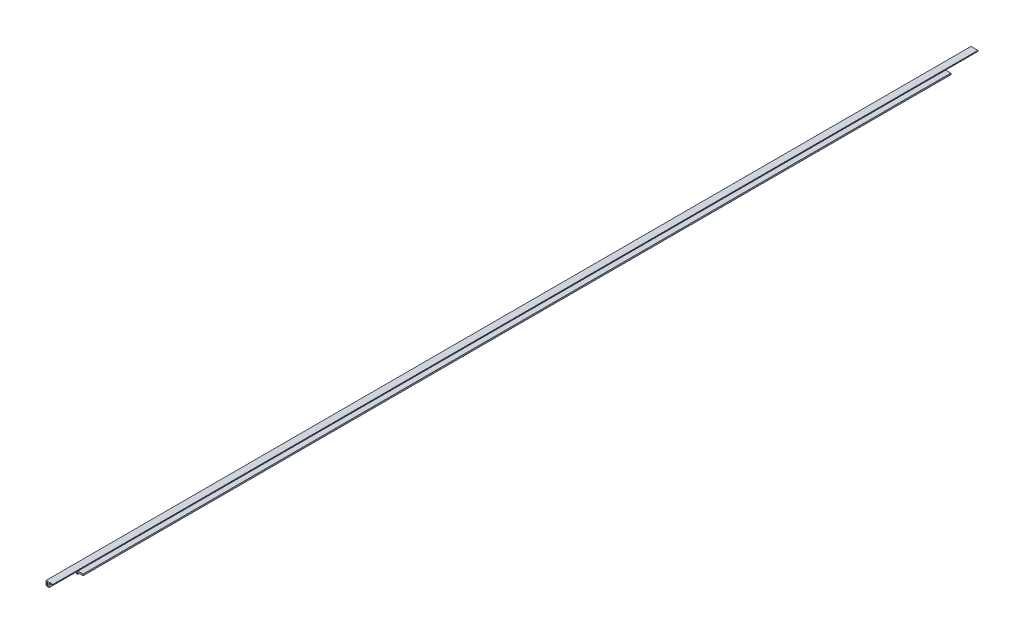
ISO-10303-21;
HEADER;
FILE_DESCRIPTION(('STEP AP214'),'2;1');
FILE_NAME('part.step','',(''),(''),'','','');
FILE_SCHEMA(('AUTOMOTIVE_DESIGN { 1 0 10303 214 1 1 1 1 }'));
ENDSEC;
DATA;
#1=APPLICATION_CONTEXT('core data for automotive mechanical design processes');
#2=APPLICATION_PROTOCOL_DEFINITION('international standard','automotive_design',2000,#1);
#3=PRODUCT_CONTEXT('',#1,'mechanical');
#4=PRODUCT('Part','Part','',(#3));
#5=PRODUCT_RELATED_PRODUCT_CATEGORY('part','',(#4));
#6=PRODUCT_DEFINITION_FORMATION('','',#4);
#7=PRODUCT_DEFINITION_CONTEXT('part definition',#1,'design');
#8=PRODUCT_DEFINITION('design','',#6,#7);
#9=PRODUCT_DEFINITION_SHAPE('','',#8);
#10=(LENGTH_UNIT() NAMED_UNIT(*) SI_UNIT(.MILLI.,.METRE.));
#11=(NAMED_UNIT(*) PLANE_ANGLE_UNIT() SI_UNIT($,.RADIAN.));
#12=(NAMED_UNIT(*) SI_UNIT($,.STERADIAN.) SOLID_ANGLE_UNIT());
#13=UNCERTAINTY_MEASURE_WITH_UNIT(LENGTH_MEASURE(1.E-05),#10,'distance_accuracy_value','');
#14=(GEOMETRIC_REPRESENTATION_CONTEXT(3) GLOBAL_UNCERTAINTY_ASSIGNED_CONTEXT((#13)) GLOBAL_UNIT_ASSIGNED_CONTEXT((#10,
#11,#12)) REPRESENTATION_CONTEXT('',''));
#15=CARTESIAN_POINT('',(0.,0.,0.));
#16=DIRECTION('',(0.,0.,1.));
#17=DIRECTION('',(1.,0.,0.));
#18=AXIS2_PLACEMENT_3D('',#15,#16,#17);
#19=CARTESIAN_POINT('',(-2.5,27.5,1403.5));
#20=DIRECTION('',(-1.,0.,0.));
#21=DIRECTION('',(0.,-1.,0.));
#22=AXIS2_PLACEMENT_3D('',#19,#20,#21);
#23=PLANE('',#22);
#24=DIRECTION('',(0.,0.,1.));
#25=VECTOR('',#24,1.);
#26=CARTESIAN_POINT('',(-2.5,27.5,1403.5));
#27=LINE('',#26,#25);
#28=CARTESIAN_POINT('',(-2.5,27.5,-1403.5));
#29=VERTEX_POINT('',#28);
#30=CARTESIAN_POINT('',(-2.5,27.5,1403.5));
#31=VERTEX_POINT('',#30);
#32=EDGE_CURVE('E506',#29,#31,#27,.T.);
#33=ORIENTED_EDGE('',*,*,#32,.T.);
#34=DIRECTION('',(0.,1.,0.));
#35=VECTOR('',#34,1.);
#36=CARTESIAN_POINT('',(-2.5,0.,1403.5));
#37=LINE('',#36,#35);
#38=CARTESIAN_POINT('',(-2.49999999999999,16.5,1403.5));
#39=VERTEX_POINT('',#38);
#40=EDGE_CURVE('E220',#31,#39,#37,.F.);
#41=ORIENTED_EDGE('',*,*,#40,.T.);
#42=DIRECTION('',(0.,0.,1.));
#43=VECTOR('',#42,1.);
#44=CARTESIAN_POINT('',(-2.49999999999999,16.5,1403.5));
#45=LINE('',#44,#43);
#46=CARTESIAN_POINT('',(-2.49999999999999,16.5,-1403.5));
#47=VERTEX_POINT('',#46);
#48=EDGE_CURVE('E19',#39,#47,#45,.F.);
#49=ORIENTED_EDGE('',*,*,#48,.T.);
#50=DIRECTION('',(0.,1.,0.));
#51=VECTOR('',#50,1.);
#52=CARTESIAN_POINT('',(-2.5,0.,-1403.5));
#53=LINE('',#52,#51);
#54=EDGE_CURVE('E217',#29,#47,#53,.F.);
#55=ORIENTED_EDGE('',*,*,#54,.F.);
#56=EDGE_LOOP('',(#33,#41,#49,#55));
#57=FACE_BOUND('',#56,.T.);
#58=ADVANCED_FACE('F16',(#57),#23,.F.);
#59=CARTESIAN_POINT('',(-2.49999999999999,16.5,1403.5));
#60=DIRECTION('',(0.,1.,0.));
#61=DIRECTION('',(0.,0.,1.));
#62=AXIS2_PLACEMENT_3D('',#59,#60,#61);
#63=PLANE('',#62);
#64=ORIENTED_EDGE('',*,*,#48,.F.);
#65=DIRECTION('',(-1.,0.,0.));
#66=VECTOR('',#65,1.);
#67=CARTESIAN_POINT('',(0.,16.5,1403.5));
#68=LINE('',#67,#66);
#69=CARTESIAN_POINT('',(-5.29999999999999,16.5,1403.5));
#70=VERTEX_POINT('',#69);
#71=EDGE_CURVE('E492',#39,#70,#68,.T.);
#72=ORIENTED_EDGE('',*,*,#71,.T.);
#73=DIRECTION('',(0.,0.,1.));
#74=VECTOR('',#73,1.);
#75=CARTESIAN_POINT('',(-5.29999999999999,16.5,1403.5));
#76=LINE('',#75,#74);
#77=CARTESIAN_POINT('',(-5.29999999999999,16.5,-1403.5));
#78=VERTEX_POINT('',#77);
#79=EDGE_CURVE('E207',#70,#78,#76,.F.);
#80=ORIENTED_EDGE('',*,*,#79,.T.);
#81=DIRECTION('',(-1.,0.,0.));
#82=VECTOR('',#81,1.);
#83=CARTESIAN_POINT('',(0.,16.5,-1403.5));
#84=LINE('',#83,#82);
#85=EDGE_CURVE('E222',#47,#78,#84,.T.);
#86=ORIENTED_EDGE('',*,*,#85,.F.);
#87=EDGE_LOOP('',(#64,#72,#80,#86));
#88=FACE_BOUND('',#87,.T.);
#89=ADVANCED_FACE('F223',(#88),#63,.F.);
#90=CARTESIAN_POINT('',(-5.29999999999999,16.5,1403.5));
#91=DIRECTION('',(1.,0.,0.));
#92=DIRECTION('',(0.,1.,0.));
#93=AXIS2_PLACEMENT_3D('',#90,#91,#92);
#94=PLANE('',#93);
#95=ORIENTED_EDGE('',*,*,#79,.F.);
#96=DIRECTION('',(0.,1.,0.));
#97=VECTOR('',#96,1.);
#98=CARTESIAN_POINT('',(-5.29999999999999,0.,1403.5));
#99=LINE('',#98,#97);
#100=CARTESIAN_POINT('',(-5.29999999999999,30.,1403.5));
#101=VERTEX_POINT('',#100);
#102=EDGE_CURVE('E489',#70,#101,#99,.T.);
#103=ORIENTED_EDGE('',*,*,#102,.T.);
#104=DIRECTION('',(0.,0.,-1.));
#105=VECTOR('',#104,1.);
#106=CARTESIAN_POINT('',(-5.3,30.,1403.5));
#107=LINE('',#106,#105);
#108=CARTESIAN_POINT('',(-5.29999999999999,30.,-1403.5));
#109=VERTEX_POINT('',#108);
#110=EDGE_CURVE('E205',#101,#109,#107,.T.);
#111=ORIENTED_EDGE('',*,*,#110,.T.);
#112=DIRECTION('',(0.,1.,0.));
#113=VECTOR('',#112,1.);
#114=CARTESIAN_POINT('',(-5.29999999999999,0.,-1403.5));
#115=LINE('',#114,#113);
#116=EDGE_CURVE('E225',#78,#109,#115,.T.);
#117=ORIENTED_EDGE('',*,*,#116,.F.);
#118=EDGE_LOOP('',(#95,#103,#111,#117));
#119=FACE_BOUND('',#118,.T.);
#120=ADVANCED_FACE('F450',(#119),#94,.F.);
#121=CARTESIAN_POINT('',(-5.3,30.,1403.5));
#122=DIRECTION('',(0.,-1.,0.));
#123=DIRECTION('',(0.,0.,-1.));
#124=AXIS2_PLACEMENT_3D('',#121,#122,#123);
#125=PLANE('',#124);
#126=ORIENTED_EDGE('',*,*,#110,.F.);
#127=DIRECTION('',(-1.,0.,0.));
#128=VECTOR('',#127,1.);
#129=CARTESIAN_POINT('',(0.,30.,1403.5));
#130=LINE('',#129,#128);
#131=CARTESIAN_POINT('',(15.7,30.,1403.5));
#132=VERTEX_POINT('',#131);
#133=EDGE_CURVE('E495',#101,#132,#130,.F.);
#134=ORIENTED_EDGE('',*,*,#133,.T.);
#135=DIRECTION('',(0.,0.,1.));
#136=VECTOR('',#135,1.);
#137=CARTESIAN_POINT('',(15.7,30.,1403.5));
#138=LINE('',#137,#136);
#139=CARTESIAN_POINT('',(15.7,30.,-1403.5));
#140=VERTEX_POINT('',#139);
#141=EDGE_CURVE('E202',#132,#140,#138,.F.);
#142=ORIENTED_EDGE('',*,*,#141,.T.);
#143=DIRECTION('',(-1.,0.,0.));
#144=VECTOR('',#143,1.);
#145=CARTESIAN_POINT('',(0.,30.,-1403.5));
#146=LINE('',#145,#144);
#147=EDGE_CURVE('E227',#109,#140,#146,.F.);
#148=ORIENTED_EDGE('',*,*,#147,.F.);
#149=EDGE_LOOP('',(#126,#134,#142,#148));
#150=FACE_BOUND('',#149,.T.);
#151=ADVANCED_FACE('F441',(#150),#125,.F.);
#152=CARTESIAN_POINT('',(15.7,30.,1403.5));
#153=DIRECTION('',(-1.,0.,0.));
#154=DIRECTION('',(0.,-1.,0.));
#155=AXIS2_PLACEMENT_3D('',#152,#153,#154);
#156=PLANE('',#155);
#157=ORIENTED_EDGE('',*,*,#141,.F.);
#158=DIRECTION('',(0.,1.,0.));
#159=VECTOR('',#158,1.);
#160=CARTESIAN_POINT('',(15.7,0.,1403.5));
#161=LINE('',#160,#159);
#162=CARTESIAN_POINT('',(15.7,27.5,1403.5));
#163=VERTEX_POINT('',#162);
#164=EDGE_CURVE('E516',#132,#163,#161,.F.);
#165=ORIENTED_EDGE('',*,*,#164,.T.);
#166=DIRECTION('',(0.,0.,1.));
#167=VECTOR('',#166,1.);
#168=CARTESIAN_POINT('',(15.7,27.5,1403.5));
#169=LINE('',#168,#167);
#170=CARTESIAN_POINT('',(15.7,27.5,-1403.5));
#171=VERTEX_POINT('',#170);
#172=EDGE_CURVE('E199',#163,#171,#169,.F.);
#173=ORIENTED_EDGE('',*,*,#172,.T.);
#174=DIRECTION('',(0.,1.,0.));
#175=VECTOR('',#174,1.);
#176=CARTESIAN_POINT('',(15.7,0.,-1403.5));
#177=LINE('',#176,#175);
#178=EDGE_CURVE('E511',#140,#171,#177,.F.);
#179=ORIENTED_EDGE('',*,*,#178,.F.);
#180=EDGE_LOOP('',(#157,#165,#173,#179));
#181=FACE_BOUND('',#180,.T.);
#182=ADVANCED_FACE('F432',(#181),#156,.F.);
#183=CARTESIAN_POINT('',(15.7,27.5,1403.5));
#184=DIRECTION('',(0.,1.,0.));
#185=DIRECTION('',(-1.,0.,0.));
#186=AXIS2_PLACEMENT_3D('',#183,#184,#185);
#187=PLANE('',#186);
#188=ORIENTED_EDGE('',*,*,#172,.F.);
#189=DIRECTION('',(-1.,0.,0.));
#190=VECTOR('',#189,1.);
#191=CARTESIAN_POINT('',(0.,27.5,1403.5));
#192=LINE('',#191,#190);
#193=CARTESIAN_POINT('',(4.5,27.5,1403.5));
#194=VERTEX_POINT('',#193);
#195=EDGE_CURVE('E582',#163,#194,#192,.T.);
#196=ORIENTED_EDGE('',*,*,#195,.T.);
#197=DIRECTION('',(0.,0.,1.));
#198=VECTOR('',#197,1.);
#199=CARTESIAN_POINT('',(4.5,27.5,1403.5));
#200=LINE('',#199,#198);
#201=CARTESIAN_POINT('',(4.5,27.5,-1403.5));
#202=VERTEX_POINT('',#201);
#203=EDGE_CURVE('E197',#194,#202,#200,.F.);
#204=ORIENTED_EDGE('',*,*,#203,.T.);
#205=DIRECTION('',(-1.,0.,0.));
#206=VECTOR('',#205,1.);
#207=CARTESIAN_POINT('',(0.,27.5,-1403.5));
#208=LINE('',#207,#206);
#209=EDGE_CURVE('E508',#171,#202,#208,.T.);
#210=ORIENTED_EDGE('',*,*,#209,.F.);
#211=EDGE_LOOP('',(#188,#196,#204,#210));
#212=FACE_BOUND('',#211,.T.);
#213=ADVANCED_FACE('F423',(#212),#187,.F.);
#214=CARTESIAN_POINT('',(4.5,27.5,1403.5));
#215=DIRECTION('',(-1.,0.,0.));
#216=DIRECTION('',(0.,-1.,0.));
#217=AXIS2_PLACEMENT_3D('',#214,#215,#216);
#218=PLANE('',#217);
#219=ORIENTED_EDGE('',*,*,#203,.F.);
#220=DIRECTION('',(0.,1.,0.));
#221=VECTOR('',#220,1.);
#222=CARTESIAN_POINT('',(4.5,0.,1403.5));
#223=LINE('',#222,#221);
#224=CARTESIAN_POINT('',(4.5,16.,1403.5));
#225=VERTEX_POINT('',#224);
#226=EDGE_CURVE('E580',#194,#225,#223,.F.);
#227=ORIENTED_EDGE('',*,*,#226,.T.);
#228=DIRECTION('',(0.,0.,1.));
#229=VECTOR('',#228,1.);
#230=CARTESIAN_POINT('',(4.5,16.,1403.5));
#231=LINE('',#230,#229);
#232=CARTESIAN_POINT('',(4.5,16.,1316.5));
#233=VERTEX_POINT('',#232);
#234=EDGE_CURVE('E578',#225,#233,#231,.F.);
#235=ORIENTED_EDGE('',*,*,#234,.T.);
#236=DIRECTION('',(0.,0.,-1.));
#237=VECTOR('',#236,1.);
#238=CARTESIAN_POINT('',(4.5,16.,1403.5));
#239=LINE('',#238,#237);
#240=CARTESIAN_POINT('',(4.5,16.,-1316.5));
#241=VERTEX_POINT('',#240);
#242=EDGE_CURVE('E195',#233,#241,#239,.T.);
#243=ORIENTED_EDGE('',*,*,#242,.T.);
#244=DIRECTION('',(0.,0.,-1.));
#245=VECTOR('',#244,1.);
#246=CARTESIAN_POINT('',(4.5,16.,-1403.5));
#247=LINE('',#246,#245);
#248=CARTESIAN_POINT('',(4.5,16.,-1403.5));
#249=VERTEX_POINT('',#248);
#250=EDGE_CURVE('E238',#249,#241,#247,.F.);
#251=ORIENTED_EDGE('',*,*,#250,.F.);
#252=DIRECTION('',(0.,1.,0.));
#253=VECTOR('',#252,1.);
#254=CARTESIAN_POINT('',(4.5,0.,-1403.5));
#255=LINE('',#254,#253);
#256=EDGE_CURVE('E234',#202,#249,#255,.F.);
#257=ORIENTED_EDGE('',*,*,#256,.F.);
#258=EDGE_LOOP('',(#219,#227,#235,#243,#251,#257));
#259=FACE_BOUND('',#258,.T.);
#260=ADVANCED_FACE('F414',(#259),#218,.F.);
#261=CARTESIAN_POINT('',(4.5,16.,1403.5));
#262=DIRECTION('',(0.,-1.,0.));
#263=DIRECTION('',(0.,0.,-1.));
#264=AXIS2_PLACEMENT_3D('',#261,#262,#263);
#265=PLANE('',#264);
#266=ORIENTED_EDGE('',*,*,#242,.F.);
#267=DIRECTION('',(-1.,0.,0.));
#268=VECTOR('',#267,1.);
#269=CARTESIAN_POINT('',(-5.3,16.,1316.5));
#270=LINE('',#269,#268);
#271=CARTESIAN_POINT('',(20.2,16.,1316.5));
#272=VERTEX_POINT('',#271);
#273=EDGE_CURVE('E567',#233,#272,#270,.F.);
#274=ORIENTED_EDGE('',*,*,#273,.T.);
#275=DIRECTION('',(0.,0.,1.));
#276=VECTOR('',#275,1.);
#277=CARTESIAN_POINT('',(20.2,16.,1403.5));
#278=LINE('',#277,#276);
#279=CARTESIAN_POINT('',(20.2,16.,-1316.5));
#280=VERTEX_POINT('',#279);
#281=EDGE_CURVE('E192',#272,#280,#278,.F.);
#282=ORIENTED_EDGE('',*,*,#281,.T.);
#283=DIRECTION('',(-1.,0.,0.));
#284=VECTOR('',#283,1.);
#285=CARTESIAN_POINT('',(-5.3,16.,-1316.5));
#286=LINE('',#285,#284);
#287=EDGE_CURVE('E182',#241,#280,#286,.F.);
#288=ORIENTED_EDGE('',*,*,#287,.F.);
#289=EDGE_LOOP('',(#266,#274,#282,#288));
#290=FACE_BOUND('',#289,.T.);
#291=ADVANCED_FACE('F259',(#290),#265,.F.);
#292=CARTESIAN_POINT('',(20.2,16.,1403.5));
#293=DIRECTION('',(-1.,0.,0.));
#294=DIRECTION('',(0.,0.,1.));
#295=AXIS2_PLACEMENT_3D('',#292,#293,#294);
#296=PLANE('',#295);
#297=ORIENTED_EDGE('',*,*,#281,.F.);
#298=DIRECTION('',(0.,1.,0.));
#299=VECTOR('',#298,1.);
#300=CARTESIAN_POINT('',(20.2,16.,1316.5));
#301=LINE('',#300,#299);
#302=CARTESIAN_POINT('',(20.2,11.5,1316.5));
#303=VERTEX_POINT('',#302);
#304=EDGE_CURVE('E248',#272,#303,#301,.F.);
#305=ORIENTED_EDGE('',*,*,#304,.T.);
#306=DIRECTION('',(0.,0.,1.));
#307=VECTOR('',#306,1.);
#308=CARTESIAN_POINT('',(20.2,11.5,1403.5));
#309=LINE('',#308,#307);
#310=CARTESIAN_POINT('',(20.2,11.5,-1316.5));
#311=VERTEX_POINT('',#310);
#312=EDGE_CURVE('E189',#303,#311,#309,.F.);
#313=ORIENTED_EDGE('',*,*,#312,.T.);
#314=DIRECTION('',(0.,1.,0.));
#315=VECTOR('',#314,1.);
#316=CARTESIAN_POINT('',(20.2,16.,-1316.5));
#317=LINE('',#316,#315);
#318=EDGE_CURVE('E184',#280,#311,#317,.F.);
#319=ORIENTED_EDGE('',*,*,#318,.F.);
#320=EDGE_LOOP('',(#297,#305,#313,#319));
#321=FACE_BOUND('',#320,.T.);
#322=ADVANCED_FACE('F246',(#321),#296,.F.);
#323=CARTESIAN_POINT('',(20.2,11.5,1403.5));
#324=DIRECTION('',(0.,1.,0.));
#325=DIRECTION('',(-1.,0.,0.));
#326=AXIS2_PLACEMENT_3D('',#323,#324,#325);
#327=PLANE('',#326);
#328=ORIENTED_EDGE('',*,*,#312,.F.);
#329=DIRECTION('',(-1.,0.,0.));
#330=VECTOR('',#329,1.);
#331=CARTESIAN_POINT('',(-5.3,11.5,1316.5));
#332=LINE('',#331,#330);
#333=CARTESIAN_POINT('',(4.,11.5,1316.5));
#334=VERTEX_POINT('',#333);
#335=EDGE_CURVE('E564',#303,#334,#332,.T.);
#336=ORIENTED_EDGE('',*,*,#335,.T.);
#337=DIRECTION('',(0.,0.,1.));
#338=VECTOR('',#337,1.);
#339=CARTESIAN_POINT('',(4.,11.5,1403.5));
#340=LINE('',#339,#338);
#341=CARTESIAN_POINT('',(4.,11.5,-1316.5));
#342=VERTEX_POINT('',#341);
#343=EDGE_CURVE('E155',#334,#342,#340,.F.);
#344=ORIENTED_EDGE('',*,*,#343,.T.);
#345=DIRECTION('',(-1.,0.,0.));
#346=VECTOR('',#345,1.);
#347=CARTESIAN_POINT('',(-5.3,11.5,-1316.5));
#348=LINE('',#347,#346);
#349=EDGE_CURVE('E167',#311,#342,#348,.T.);
#350=ORIENTED_EDGE('',*,*,#349,.F.);
#351=EDGE_LOOP('',(#328,#336,#344,#350));
#352=FACE_BOUND('',#351,.T.);
#353=ADVANCED_FACE('F250',(#352),#327,.F.);
#354=CARTESIAN_POINT('',(4.,11.5,1403.5));
#355=DIRECTION('',(-1.,0.,0.));
#356=DIRECTION('',(0.,0.,1.));
#357=AXIS2_PLACEMENT_3D('',#354,#355,#356);
#358=PLANE('',#357);
#359=DIRECTION('',(0.,0.,-1.));
#360=VECTOR('',#359,1.);
#361=CARTESIAN_POINT('',(4.,7.,-1316.5));
#362=LINE('',#361,#360);
#363=CARTESIAN_POINT('',(4.,7.,-1316.5));
#364=VERTEX_POINT('',#363);
#365=CARTESIAN_POINT('',(4.,7.,-1286.5));
#366=VERTEX_POINT('',#365);
#367=EDGE_CURVE('E169',#364,#366,#362,.F.);
#368=ORIENTED_EDGE('',*,*,#367,.F.);
#369=DIRECTION('',(0.,1.,0.));
#370=VECTOR('',#369,1.);
#371=CARTESIAN_POINT('',(4.,16.,-1316.5));
#372=LINE('',#371,#370);
#373=EDGE_CURVE('E160',#342,#364,#372,.F.);
#374=ORIENTED_EDGE('',*,*,#373,.F.);
#375=ORIENTED_EDGE('',*,*,#343,.F.);
#376=DIRECTION('',(0.,1.,0.));
#377=VECTOR('',#376,1.);
#378=CARTESIAN_POINT('',(4.,16.,1316.5));
#379=LINE('',#378,#377);
#380=CARTESIAN_POINT('',(4.,7.,1316.5));
#381=VERTEX_POINT('',#380);
#382=EDGE_CURVE('E573',#334,#381,#379,.F.);
#383=ORIENTED_EDGE('',*,*,#382,.T.);
#384=DIRECTION('',(0.,0.,1.));
#385=VECTOR('',#384,1.);
#386=CARTESIAN_POINT('',(4.,7.,1316.5));
#387=LINE('',#386,#385);
#388=CARTESIAN_POINT('',(4.,7.,1286.5));
#389=VERTEX_POINT('',#388);
#390=EDGE_CURVE('E561',#381,#389,#387,.F.);
#391=ORIENTED_EDGE('',*,*,#390,.T.);
#392=DIRECTION('',(0.,1.,0.));
#393=VECTOR('',#392,1.);
#394=CARTESIAN_POINT('',(4.,0.,1286.5));
#395=LINE('',#394,#393);
#396=CARTESIAN_POINT('',(4.,0.,1286.5));
#397=VERTEX_POINT('',#396);
#398=EDGE_CURVE('E556',#389,#397,#395,.F.);
#399=ORIENTED_EDGE('',*,*,#398,.T.);
#400=DIRECTION('',(0.,0.,1.));
#401=VECTOR('',#400,1.);
#402=CARTESIAN_POINT('',(4.,0.,1403.5));
#403=LINE('',#402,#401);
#404=CARTESIAN_POINT('',(4.,0.,-1286.5));
#405=VERTEX_POINT('',#404);
#406=EDGE_CURVE('E548',#397,#405,#403,.F.);
#407=ORIENTED_EDGE('',*,*,#406,.T.);
#408=DIRECTION('',(0.,1.,0.));
#409=VECTOR('',#408,1.);
#410=CARTESIAN_POINT('',(4.,0.,-1286.5));
#411=LINE('',#410,#409);
#412=EDGE_CURVE('E174',#366,#405,#411,.F.);
#413=ORIENTED_EDGE('',*,*,#412,.F.);
#414=EDGE_LOOP('',(#368,#374,#375,#383,#391,#399,#407,#413));
#415=FACE_BOUND('',#414,.T.);
#416=ADVANCED_FACE('F172',(#415),#358,.F.);
#417=CARTESIAN_POINT('',(-5.3,7.,-1316.5));
#418=DIRECTION('',(0.,-1.,0.));
#419=DIRECTION('',(0.,0.,-1.));
#420=AXIS2_PLACEMENT_3D('',#417,#418,#419);
#421=PLANE('',#420);
#422=DIRECTION('',(0.,0.,1.));
#423=VECTOR('',#422,1.);
#424=CARTESIAN_POINT('',(0.,7.,1403.5));
#425=LINE('',#424,#423);
#426=CARTESIAN_POINT('',(0.,7.,-1286.5));
#427=VERTEX_POINT('',#426);
#428=CARTESIAN_POINT('',(0.,7.,-1316.5));
#429=VERTEX_POINT('',#428);
#430=EDGE_CURVE('E181',#427,#429,#425,.F.);
#431=ORIENTED_EDGE('',*,*,#430,.T.);
#432=DIRECTION('',(-1.,0.,0.));
#433=VECTOR('',#432,1.);
#434=CARTESIAN_POINT('',(-5.3,7.,-1316.5));
#435=LINE('',#434,#433);
#436=EDGE_CURVE('E165',#364,#429,#435,.T.);
#437=ORIENTED_EDGE('',*,*,#436,.F.);
#438=ORIENTED_EDGE('',*,*,#367,.T.);
#439=DIRECTION('',(-1.,0.,0.));
#440=VECTOR('',#439,1.);
#441=CARTESIAN_POINT('',(-5.3,7.,-1286.5));
#442=LINE('',#441,#440);
#443=EDGE_CURVE('E544',#427,#366,#442,.F.);
#444=ORIENTED_EDGE('',*,*,#443,.F.);
#445=EDGE_LOOP('',(#431,#437,#438,#444));
#446=FACE_BOUND('',#445,.T.);
#447=ADVANCED_FACE('F180',(#446),#421,.T.);
#448=CARTESIAN_POINT('',(-5.3,16.,-1316.5));
#449=DIRECTION('',(0.,0.,-1.));
#450=DIRECTION('',(-1.,0.,0.));
#451=AXIS2_PLACEMENT_3D('',#448,#449,#450);
#452=PLANE('',#451);
#453=ORIENTED_EDGE('',*,*,#318,.T.);
#454=ORIENTED_EDGE('',*,*,#349,.T.);
#455=ORIENTED_EDGE('',*,*,#373,.T.);
#456=ORIENTED_EDGE('',*,*,#436,.T.);
#457=DIRECTION('',(0.,1.,0.));
#458=VECTOR('',#457,1.);
#459=CARTESIAN_POINT('',(0.,0.,-1316.5));
#460=LINE('',#459,#458);
#461=CARTESIAN_POINT('',(0.,16.,-1316.5));
#462=VERTEX_POINT('',#461);
#463=EDGE_CURVE('E538',#429,#462,#460,.T.);
#464=ORIENTED_EDGE('',*,*,#463,.T.);
#465=DIRECTION('',(1.,0.,0.));
#466=VECTOR('',#465,1.);
#467=CARTESIAN_POINT('',(-5.3,16.,-1316.5));
#468=LINE('',#467,#466);
#469=EDGE_CURVE('E236',#241,#462,#468,.F.);
#470=ORIENTED_EDGE('',*,*,#469,.F.);
#471=ORIENTED_EDGE('',*,*,#287,.T.);
#472=EDGE_LOOP('',(#453,#454,#455,#456,#464,#470,#471));
#473=FACE_BOUND('',#472,.T.);
#474=ADVANCED_FACE('F162',(#473),#452,.T.);
#475=CARTESIAN_POINT('',(-5.3,16.,-1403.5));
#476=DIRECTION('',(0.,-1.,0.));
#477=DIRECTION('',(0.,0.,-1.));
#478=AXIS2_PLACEMENT_3D('',#475,#476,#477);
#479=PLANE('',#478);
#480=DIRECTION('',(0.,0.,1.));
#481=VECTOR('',#480,1.);
#482=CARTESIAN_POINT('',(0.,16.,1403.5));
#483=LINE('',#482,#481);
#484=CARTESIAN_POINT('',(0.,16.,-1403.5));
#485=VERTEX_POINT('',#484);
#486=EDGE_CURVE('E527',#462,#485,#483,.F.);
#487=ORIENTED_EDGE('',*,*,#486,.T.);
#488=DIRECTION('',(-1.,0.,0.));
#489=VECTOR('',#488,1.);
#490=CARTESIAN_POINT('',(0.,16.,-1403.5));
#491=LINE('',#490,#489);
#492=EDGE_CURVE('E229',#249,#485,#491,.T.);
#493=ORIENTED_EDGE('',*,*,#492,.F.);
#494=ORIENTED_EDGE('',*,*,#250,.T.);
#495=ORIENTED_EDGE('',*,*,#469,.T.);
#496=EDGE_LOOP('',(#487,#493,#494,#495));
#497=FACE_BOUND('',#496,.T.);
#498=ADVANCED_FACE('F303',(#497),#479,.T.);
#499=CARTESIAN_POINT('',(0.,0.,-1403.5));
#500=DIRECTION('',(0.,0.,-1.));
#501=DIRECTION('',(-1.,0.,0.));
#502=AXIS2_PLACEMENT_3D('',#499,#500,#501);
#503=PLANE('',#502);
#504=ORIENTED_EDGE('',*,*,#178,.T.);
#505=ORIENTED_EDGE('',*,*,#209,.T.);
#506=ORIENTED_EDGE('',*,*,#256,.T.);
#507=ORIENTED_EDGE('',*,*,#492,.T.);
#508=DIRECTION('',(0.,1.,0.));
#509=VECTOR('',#508,1.);
#510=CARTESIAN_POINT('',(0.,0.,-1403.5));
#511=LINE('',#510,#509);
#512=CARTESIAN_POINT('',(0.,27.5,-1403.5));
#513=VERTEX_POINT('',#512);
#514=EDGE_CURVE('E530',#485,#513,#511,.T.);
#515=ORIENTED_EDGE('',*,*,#514,.T.);
#516=DIRECTION('',(1.,0.,0.));
#517=VECTOR('',#516,1.);
#518=CARTESIAN_POINT('',(0.,27.5,-1403.5));
#519=LINE('',#518,#517);
#520=EDGE_CURVE('E504',#513,#29,#519,.F.);
#521=ORIENTED_EDGE('',*,*,#520,.T.);
#522=ORIENTED_EDGE('',*,*,#54,.T.);
#523=ORIENTED_EDGE('',*,*,#85,.T.);
#524=ORIENTED_EDGE('',*,*,#116,.T.);
#525=ORIENTED_EDGE('',*,*,#147,.T.);
#526=EDGE_LOOP('',(#504,#505,#506,#507,#515,#521,#522,#523,#524,#525));
#527=FACE_BOUND('',#526,.T.);
#528=ADVANCED_FACE('F299',(#527),#503,.T.);
#529=CARTESIAN_POINT('',(0.,27.5,1403.5));
#530=DIRECTION('',(0.,1.,0.));
#531=DIRECTION('',(0.,0.,1.));
#532=AXIS2_PLACEMENT_3D('',#529,#530,#531);
#533=PLANE('',#532);
#534=DIRECTION('',(0.,0.,1.));
#535=VECTOR('',#534,1.);
#536=CARTESIAN_POINT('',(0.,27.5,1403.5));
#537=LINE('',#536,#535);
#538=CARTESIAN_POINT('',(0.,27.5,1403.5));
#539=VERTEX_POINT('',#538);
#540=EDGE_CURVE('E534',#513,#539,#537,.T.);
#541=ORIENTED_EDGE('',*,*,#540,.T.);
#542=DIRECTION('',(-1.,0.,0.));
#543=VECTOR('',#542,1.);
#544=CARTESIAN_POINT('',(0.,27.5,1403.5));
#545=LINE('',#544,#543);
#546=EDGE_CURVE('E498',#539,#31,#545,.T.);
#547=ORIENTED_EDGE('',*,*,#546,.T.);
#548=ORIENTED_EDGE('',*,*,#32,.F.);
#549=ORIENTED_EDGE('',*,*,#520,.F.);
#550=EDGE_LOOP('',(#541,#547,#548,#549));
#551=FACE_BOUND('',#550,.T.);
#552=ADVANCED_FACE('F295',(#551),#533,.F.);
#553=CARTESIAN_POINT('',(0.,0.,1403.5));
#554=DIRECTION('',(0.,0.,-1.));
#555=DIRECTION('',(-1.,0.,0.));
#556=AXIS2_PLACEMENT_3D('',#553,#554,#555);
#557=PLANE('',#556);
#558=DIRECTION('',(1.,0.,0.));
#559=VECTOR('',#558,1.);
#560=CARTESIAN_POINT('',(-5.3,16.,1403.5));
#561=LINE('',#560,#559);
#562=CARTESIAN_POINT('',(0.,16.,1403.5));
#563=VERTEX_POINT('',#562);
#564=EDGE_CURVE('E576',#563,#225,#561,.T.);
#565=ORIENTED_EDGE('',*,*,#564,.T.);
#566=ORIENTED_EDGE('',*,*,#226,.F.);
#567=ORIENTED_EDGE('',*,*,#195,.F.);
#568=ORIENTED_EDGE('',*,*,#164,.F.);
#569=ORIENTED_EDGE('',*,*,#133,.F.);
#570=ORIENTED_EDGE('',*,*,#102,.F.);
#571=ORIENTED_EDGE('',*,*,#71,.F.);
#572=ORIENTED_EDGE('',*,*,#40,.F.);
#573=ORIENTED_EDGE('',*,*,#546,.F.);
#574=DIRECTION('',(0.,1.,0.));
#575=VECTOR('',#574,1.);
#576=CARTESIAN_POINT('',(0.,0.,1403.5));
#577=LINE('',#576,#575);
#578=EDGE_CURVE('E536',#539,#563,#577,.F.);
#579=ORIENTED_EDGE('',*,*,#578,.T.);
#580=EDGE_LOOP('',(#565,#566,#567,#568,#569,#570,#571,#572,#573,#579));
#581=FACE_BOUND('',#580,.T.);
#582=ADVANCED_FACE('F291',(#581),#557,.F.);
#583=CARTESIAN_POINT('',(-5.3,16.,1403.5));
#584=DIRECTION('',(0.,1.,0.));
#585=DIRECTION('',(0.,0.,1.));
#586=AXIS2_PLACEMENT_3D('',#583,#584,#585);
#587=PLANE('',#586);
#588=DIRECTION('',(0.,0.,1.));
#589=VECTOR('',#588,1.);
#590=CARTESIAN_POINT('',(0.,16.,1403.5));
#591=LINE('',#590,#589);
#592=CARTESIAN_POINT('',(0.,16.,1316.5));
#593=VERTEX_POINT('',#592);
#594=EDGE_CURVE('E590',#563,#593,#591,.F.);
#595=ORIENTED_EDGE('',*,*,#594,.T.);
#596=DIRECTION('',(-1.,0.,0.));
#597=VECTOR('',#596,1.);
#598=CARTESIAN_POINT('',(-5.3,16.,1316.5));
#599=LINE('',#598,#597);
#600=EDGE_CURVE('E570',#593,#233,#599,.F.);
#601=ORIENTED_EDGE('',*,*,#600,.T.);
#602=ORIENTED_EDGE('',*,*,#234,.F.);
#603=ORIENTED_EDGE('',*,*,#564,.F.);
#604=EDGE_LOOP('',(#595,#601,#602,#603));
#605=FACE_BOUND('',#604,.T.);
#606=ADVANCED_FACE('F287',(#605),#587,.F.);
#607=CARTESIAN_POINT('',(-5.3,16.,1316.5));
#608=DIRECTION('',(0.,0.,-1.));
#609=DIRECTION('',(-1.,0.,0.));
#610=AXIS2_PLACEMENT_3D('',#607,#608,#609);
#611=PLANE('',#610);
#612=ORIENTED_EDGE('',*,*,#304,.F.);
#613=ORIENTED_EDGE('',*,*,#273,.F.);
#614=ORIENTED_EDGE('',*,*,#600,.F.);
#615=DIRECTION('',(0.,1.,0.));
#616=VECTOR('',#615,1.);
#617=CARTESIAN_POINT('',(0.,0.,1316.5));
#618=LINE('',#617,#616);
#619=CARTESIAN_POINT('',(0.,7.,1316.5));
#620=VERTEX_POINT('',#619);
#621=EDGE_CURVE('E591',#593,#620,#618,.F.);
#622=ORIENTED_EDGE('',*,*,#621,.T.);
#623=DIRECTION('',(1.,0.,0.));
#624=VECTOR('',#623,1.);
#625=CARTESIAN_POINT('',(-5.3,7.,1316.5));
#626=LINE('',#625,#624);
#627=EDGE_CURVE('E558',#620,#381,#626,.T.);
#628=ORIENTED_EDGE('',*,*,#627,.T.);
#629=ORIENTED_EDGE('',*,*,#382,.F.);
#630=ORIENTED_EDGE('',*,*,#335,.F.);
#631=EDGE_LOOP('',(#612,#613,#614,#622,#628,#629,#630));
#632=FACE_BOUND('',#631,.T.);
#633=ADVANCED_FACE('F283',(#632),#611,.F.);
#634=CARTESIAN_POINT('',(-5.3,7.,1316.5));
#635=DIRECTION('',(0.,1.,0.));
#636=DIRECTION('',(0.,0.,1.));
#637=AXIS2_PLACEMENT_3D('',#634,#635,#636);
#638=PLANE('',#637);
#639=DIRECTION('',(0.,0.,1.));
#640=VECTOR('',#639,1.);
#641=CARTESIAN_POINT('',(0.,7.,1403.5));
#642=LINE('',#641,#640);
#643=CARTESIAN_POINT('',(0.,7.,1286.5));
#644=VERTEX_POINT('',#643);
#645=EDGE_CURVE('E593',#620,#644,#642,.F.);
#646=ORIENTED_EDGE('',*,*,#645,.T.);
#647=DIRECTION('',(-1.,0.,0.));
#648=VECTOR('',#647,1.);
#649=CARTESIAN_POINT('',(-5.3,7.,1286.5));
#650=LINE('',#649,#648);
#651=EDGE_CURVE('E553',#644,#389,#650,.F.);
#652=ORIENTED_EDGE('',*,*,#651,.T.);
#653=ORIENTED_EDGE('',*,*,#390,.F.);
#654=ORIENTED_EDGE('',*,*,#627,.F.);
#655=EDGE_LOOP('',(#646,#652,#653,#654));
#656=FACE_BOUND('',#655,.T.);
#657=ADVANCED_FACE('F279',(#656),#638,.F.);
#658=CARTESIAN_POINT('',(-5.3,0.,1286.5));
#659=DIRECTION('',(0.,0.,-1.));
#660=DIRECTION('',(-1.,0.,0.));
#661=AXIS2_PLACEMENT_3D('',#658,#659,#660);
#662=PLANE('',#661);
#663=DIRECTION('',(0.,1.,0.));
#664=VECTOR('',#663,1.);
#665=CARTESIAN_POINT('',(0.,0.,1286.5));
#666=LINE('',#665,#664);
#667=CARTESIAN_POINT('',(0.,0.,1286.5));
#668=VERTEX_POINT('',#667);
#669=EDGE_CURVE('E598',#644,#668,#666,.F.);
#670=ORIENTED_EDGE('',*,*,#669,.T.);
#671=DIRECTION('',(1.,0.,0.));
#672=VECTOR('',#671,1.);
#673=CARTESIAN_POINT('',(4.,0.,1286.5));
#674=LINE('',#673,#672);
#675=EDGE_CURVE('E550',#668,#397,#674,.T.);
#676=ORIENTED_EDGE('',*,*,#675,.T.);
#677=ORIENTED_EDGE('',*,*,#398,.F.);
#678=ORIENTED_EDGE('',*,*,#651,.F.);
#679=EDGE_LOOP('',(#670,#676,#677,#678));
#680=FACE_BOUND('',#679,.T.);
#681=ADVANCED_FACE('F275',(#680),#662,.F.);
#682=CARTESIAN_POINT('',(4.,0.,1403.5));
#683=DIRECTION('',(0.,1.,0.));
#684=DIRECTION('',(0.,0.,1.));
#685=AXIS2_PLACEMENT_3D('',#682,#683,#684);
#686=PLANE('',#685);
#687=ORIENTED_EDGE('',*,*,#406,.F.);
#688=ORIENTED_EDGE('',*,*,#675,.F.);
#689=DIRECTION('',(0.,0.,1.));
#690=VECTOR('',#689,1.);
#691=CARTESIAN_POINT('',(0.,0.,1403.5));
#692=LINE('',#691,#690);
#693=CARTESIAN_POINT('',(0.,0.,-1286.5));
#694=VERTEX_POINT('',#693);
#695=EDGE_CURVE('E25',#668,#694,#692,.F.);
#696=ORIENTED_EDGE('',*,*,#695,.T.);
#697=DIRECTION('',(-1.,0.,0.));
#698=VECTOR('',#697,1.);
#699=CARTESIAN_POINT('',(-5.3,0.,-1286.5));
#700=LINE('',#699,#698);
#701=EDGE_CURVE('E33',#405,#694,#700,.T.);
#702=ORIENTED_EDGE('',*,*,#701,.F.);
#703=EDGE_LOOP('',(#687,#688,#696,#702));
#704=FACE_BOUND('',#703,.T.);
#705=ADVANCED_FACE('F269',(#704),#686,.F.);
#706=CARTESIAN_POINT('',(-5.3,0.,-1286.5));
#707=DIRECTION('',(0.,0.,-1.));
#708=DIRECTION('',(-1.,0.,0.));
#709=AXIS2_PLACEMENT_3D('',#706,#707,#708);
#710=PLANE('',#709);
#711=DIRECTION('',(0.,1.,0.));
#712=VECTOR('',#711,1.);
#713=CARTESIAN_POINT('',(0.,0.,-1286.5));
#714=LINE('',#713,#712);
#715=EDGE_CURVE('E11',#694,#427,#714,.T.);
#716=ORIENTED_EDGE('',*,*,#715,.T.);
#717=ORIENTED_EDGE('',*,*,#443,.T.);
#718=ORIENTED_EDGE('',*,*,#412,.T.);
#719=ORIENTED_EDGE('',*,*,#701,.T.);
#720=EDGE_LOOP('',(#716,#717,#718,#719));
#721=FACE_BOUND('',#720,.T.);
#722=ADVANCED_FACE('F263',(#721),#710,.T.);
#723=CARTESIAN_POINT('',(0.,0.,1403.5));
#724=DIRECTION('',(1.,0.,0.));
#725=DIRECTION('',(0.,1.,0.));
#726=AXIS2_PLACEMENT_3D('',#723,#724,#725);
#727=PLANE('',#726);
#728=ORIENTED_EDGE('',*,*,#695,.F.);
#729=ORIENTED_EDGE('',*,*,#669,.F.);
#730=ORIENTED_EDGE('',*,*,#645,.F.);
#731=ORIENTED_EDGE('',*,*,#621,.F.);
#732=ORIENTED_EDGE('',*,*,#594,.F.);
#733=ORIENTED_EDGE('',*,*,#578,.F.);
#734=ORIENTED_EDGE('',*,*,#540,.F.);
#735=ORIENTED_EDGE('',*,*,#514,.F.);
#736=ORIENTED_EDGE('',*,*,#486,.F.);
#737=ORIENTED_EDGE('',*,*,#463,.F.);
#738=ORIENTED_EDGE('',*,*,#430,.F.);
#739=ORIENTED_EDGE('',*,*,#715,.F.);
#740=EDGE_LOOP('',(#728,#729,#730,#731,#732,#733,#734,#735,#736,#737,#738,#739));
#741=FACE_BOUND('',#740,.T.);
#742=ADVANCED_FACE('F261',(#741),#727,.F.);
#743=CLOSED_SHELL('',(#58,#89,#120,#151,#182,#213,#260,#291,#322,#353,#416,#447,#474,#498,#528,
#552,#582,#606,#633,#657,#681,#705,#722,#742));
#744=MANIFOLD_SOLID_BREP('B1',#743);
#745=ADVANCED_BREP_SHAPE_REPRESENTATION('',(#18,#744),#14);
#746=SHAPE_DEFINITION_REPRESENTATION(#9,#745);
ENDSEC;
END-ISO-10303-21;
